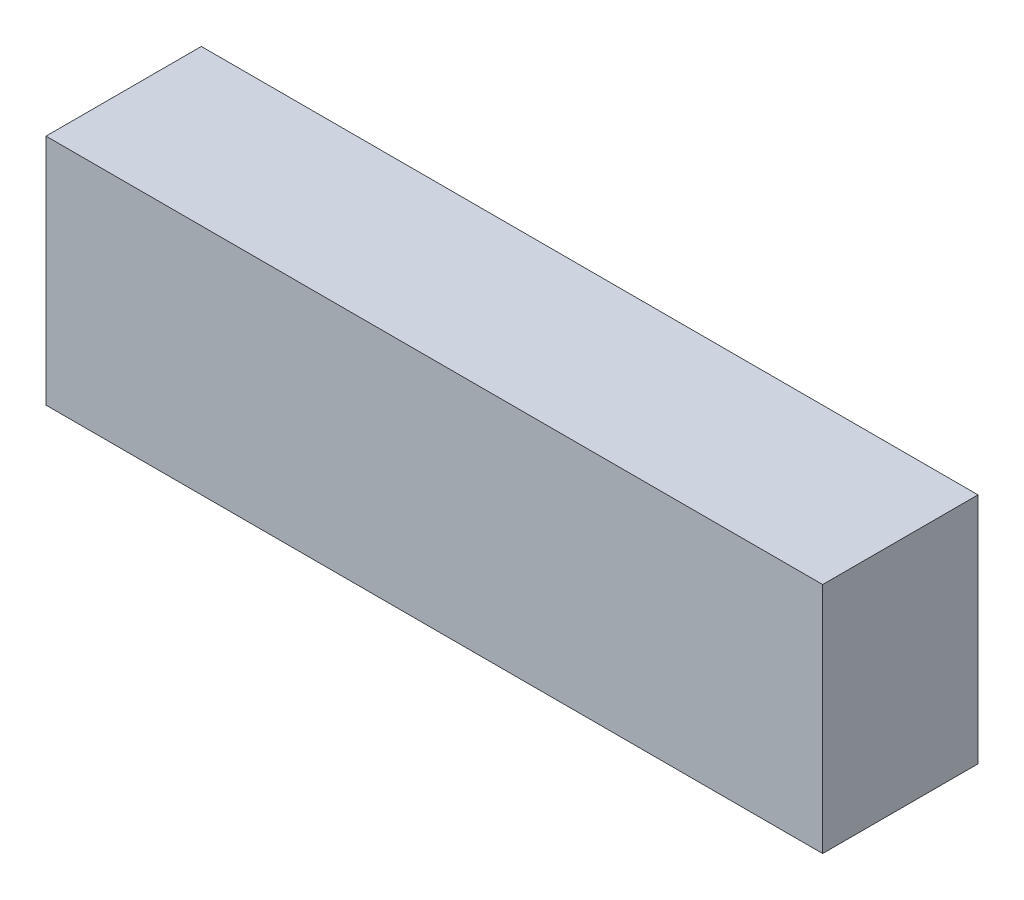
ISO-10303-21;
HEADER;
FILE_DESCRIPTION(('STEP AP214'),'2;1');
FILE_NAME('part.step','',(''),(''),'','','');
FILE_SCHEMA(('AUTOMOTIVE_DESIGN { 1 0 10303 214 1 1 1 1 }'));
ENDSEC;
DATA;
#1=APPLICATION_CONTEXT('core data for automotive mechanical design processes');
#2=APPLICATION_PROTOCOL_DEFINITION('international standard','automotive_design',2000,#1);
#3=PRODUCT_CONTEXT('',#1,'mechanical');
#4=PRODUCT('Part','Part','',(#3));
#5=PRODUCT_RELATED_PRODUCT_CATEGORY('part','',(#4));
#6=PRODUCT_DEFINITION_FORMATION('','',#4);
#7=PRODUCT_DEFINITION_CONTEXT('part definition',#1,'design');
#8=PRODUCT_DEFINITION('design','',#6,#7);
#9=PRODUCT_DEFINITION_SHAPE('','',#8);
#10=(LENGTH_UNIT() NAMED_UNIT(*) SI_UNIT(.MILLI.,.METRE.));
#11=(NAMED_UNIT(*) PLANE_ANGLE_UNIT() SI_UNIT($,.RADIAN.));
#12=(NAMED_UNIT(*) SI_UNIT($,.STERADIAN.) SOLID_ANGLE_UNIT());
#13=UNCERTAINTY_MEASURE_WITH_UNIT(LENGTH_MEASURE(1.E-05),#10,'distance_accuracy_value','');
#14=(GEOMETRIC_REPRESENTATION_CONTEXT(3) GLOBAL_UNCERTAINTY_ASSIGNED_CONTEXT((#13)) GLOBAL_UNIT_ASSIGNED_CONTEXT((#10,
#11,#12)) REPRESENTATION_CONTEXT('',''));
#15=CARTESIAN_POINT('',(0.,0.,0.));
#16=DIRECTION('',(0.,0.,1.));
#17=DIRECTION('',(1.,0.,0.));
#18=AXIS2_PLACEMENT_3D('',#15,#16,#17);
#19=CARTESIAN_POINT('',(30.,-9.,12.));
#20=DIRECTION('',(-1.,0.,0.));
#21=DIRECTION('',(0.,0.,1.));
#22=AXIS2_PLACEMENT_3D('',#19,#20,#21);
#23=PLANE('',#22);
#24=DIRECTION('',(0.,1.,0.));
#25=VECTOR('',#24,1.);
#26=CARTESIAN_POINT('',(30.,-9.,0.));
#27=LINE('',#26,#25);
#28=CARTESIAN_POINT('',(30.,-9.,0.));
#29=VERTEX_POINT('',#28);
#30=CARTESIAN_POINT('',(30.,9.,0.));
#31=VERTEX_POINT('',#30);
#32=EDGE_CURVE('E102',#29,#31,#27,.T.);
#33=ORIENTED_EDGE('',*,*,#32,.T.);
#34=DIRECTION('',(0.,0.,-1.));
#35=VECTOR('',#34,1.);
#36=CARTESIAN_POINT('',(30.,9.,12.));
#37=LINE('',#36,#35);
#38=CARTESIAN_POINT('',(30.,9.,12.));
#39=VERTEX_POINT('',#38);
#40=EDGE_CURVE('E11',#39,#31,#37,.T.);
#41=ORIENTED_EDGE('',*,*,#40,.F.);
#42=DIRECTION('',(0.,1.,0.));
#43=VECTOR('',#42,1.);
#44=CARTESIAN_POINT('',(30.,-9.,12.));
#45=LINE('',#44,#43);
#46=CARTESIAN_POINT('',(30.,-9.,12.));
#47=VERTEX_POINT('',#46);
#48=EDGE_CURVE('E95',#47,#39,#45,.T.);
#49=ORIENTED_EDGE('',*,*,#48,.F.);
#50=DIRECTION('',(0.,0.,-1.));
#51=VECTOR('',#50,1.);
#52=CARTESIAN_POINT('',(30.,-9.,12.));
#53=LINE('',#52,#51);
#54=EDGE_CURVE('E99',#47,#29,#53,.T.);
#55=ORIENTED_EDGE('',*,*,#54,.T.);
#56=EDGE_LOOP('',(#33,#41,#49,#55));
#57=FACE_BOUND('',#56,.T.);
#58=ADVANCED_FACE('F41',(#57),#23,.F.);
#59=CARTESIAN_POINT('',(-30.,9.,12.));
#60=DIRECTION('',(0.,-1.,0.));
#61=DIRECTION('',(0.,0.,-1.));
#62=AXIS2_PLACEMENT_3D('',#59,#60,#61);
#63=PLANE('',#62);
#64=DIRECTION('',(-1.,0.,0.));
#65=VECTOR('',#64,1.);
#66=CARTESIAN_POINT('',(-30.,9.,0.));
#67=LINE('',#66,#65);
#68=CARTESIAN_POINT('',(-30.,9.,0.));
#69=VERTEX_POINT('',#68);
#70=EDGE_CURVE('E96',#31,#69,#67,.T.);
#71=ORIENTED_EDGE('',*,*,#70,.T.);
#72=DIRECTION('',(0.,0.,-1.));
#73=VECTOR('',#72,1.);
#74=CARTESIAN_POINT('',(-30.,9.,12.));
#75=LINE('',#74,#73);
#76=CARTESIAN_POINT('',(-30.,9.,12.));
#77=VERTEX_POINT('',#76);
#78=EDGE_CURVE('E47',#77,#69,#75,.T.);
#79=ORIENTED_EDGE('',*,*,#78,.F.);
#80=DIRECTION('',(-1.,0.,0.));
#81=VECTOR('',#80,1.);
#82=CARTESIAN_POINT('',(-30.,9.,12.));
#83=LINE('',#82,#81);
#84=EDGE_CURVE('E87',#39,#77,#83,.T.);
#85=ORIENTED_EDGE('',*,*,#84,.F.);
#86=ORIENTED_EDGE('',*,*,#40,.T.);
#87=EDGE_LOOP('',(#71,#79,#85,#86));
#88=FACE_BOUND('',#87,.T.);
#89=ADVANCED_FACE('F92',(#88),#63,.F.);
#90=CARTESIAN_POINT('',(-30.,-9.,12.));
#91=DIRECTION('',(1.,0.,0.));
#92=DIRECTION('',(0.,0.,-1.));
#93=AXIS2_PLACEMENT_3D('',#90,#91,#92);
#94=PLANE('',#93);
#95=DIRECTION('',(0.,-1.,0.));
#96=VECTOR('',#95,1.);
#97=CARTESIAN_POINT('',(-30.,-9.,0.));
#98=LINE('',#97,#96);
#99=CARTESIAN_POINT('',(-30.,-9.,0.));
#100=VERTEX_POINT('',#99);
#101=EDGE_CURVE('E74',#69,#100,#98,.T.);
#102=ORIENTED_EDGE('',*,*,#101,.T.);
#103=DIRECTION('',(0.,0.,-1.));
#104=VECTOR('',#103,1.);
#105=CARTESIAN_POINT('',(-30.,-9.,12.));
#106=LINE('',#105,#104);
#107=CARTESIAN_POINT('',(-30.,-9.,12.));
#108=VERTEX_POINT('',#107);
#109=EDGE_CURVE('E100',#108,#100,#106,.T.);
#110=ORIENTED_EDGE('',*,*,#109,.F.);
#111=DIRECTION('',(0.,-1.,0.));
#112=VECTOR('',#111,1.);
#113=CARTESIAN_POINT('',(-30.,-9.,12.));
#114=LINE('',#113,#112);
#115=EDGE_CURVE('E89',#77,#108,#114,.T.);
#116=ORIENTED_EDGE('',*,*,#115,.F.);
#117=ORIENTED_EDGE('',*,*,#78,.T.);
#118=EDGE_LOOP('',(#102,#110,#116,#117));
#119=FACE_BOUND('',#118,.T.);
#120=ADVANCED_FACE('F98',(#119),#94,.F.);
#121=CARTESIAN_POINT('',(-30.,-9.,12.));
#122=DIRECTION('',(0.,1.,0.));
#123=DIRECTION('',(0.,0.,1.));
#124=AXIS2_PLACEMENT_3D('',#121,#122,#123);
#125=PLANE('',#124);
#126=DIRECTION('',(1.,0.,0.));
#127=VECTOR('',#126,1.);
#128=CARTESIAN_POINT('',(-30.,-9.,0.));
#129=LINE('',#128,#127);
#130=EDGE_CURVE('E76',#100,#29,#129,.T.);
#131=ORIENTED_EDGE('',*,*,#130,.T.);
#132=ORIENTED_EDGE('',*,*,#54,.F.);
#133=DIRECTION('',(1.,0.,0.));
#134=VECTOR('',#133,1.);
#135=CARTESIAN_POINT('',(-30.,-9.,12.));
#136=LINE('',#135,#134);
#137=EDGE_CURVE('E60',#108,#47,#136,.T.);
#138=ORIENTED_EDGE('',*,*,#137,.F.);
#139=ORIENTED_EDGE('',*,*,#109,.T.);
#140=EDGE_LOOP('',(#131,#132,#138,#139));
#141=FACE_BOUND('',#140,.T.);
#142=ADVANCED_FACE('F112',(#141),#125,.F.);
#143=CARTESIAN_POINT('',(0.,0.,12.));
#144=DIRECTION('',(0.,0.,-1.));
#145=DIRECTION('',(-1.,0.,0.));
#146=AXIS2_PLACEMENT_3D('',#143,#144,#145);
#147=PLANE('',#146);
#148=ORIENTED_EDGE('',*,*,#48,.T.);
#149=ORIENTED_EDGE('',*,*,#84,.T.);
#150=ORIENTED_EDGE('',*,*,#115,.T.);
#151=ORIENTED_EDGE('',*,*,#137,.T.);
#152=EDGE_LOOP('',(#148,#149,#150,#151));
#153=FACE_BOUND('',#152,.T.);
#154=ADVANCED_FACE('F86',(#153),#147,.F.);
#155=CARTESIAN_POINT('',(0.,0.,0.));
#156=DIRECTION('',(0.,0.,-1.));
#157=DIRECTION('',(-1.,0.,0.));
#158=AXIS2_PLACEMENT_3D('',#155,#156,#157);
#159=PLANE('',#158);
#160=ORIENTED_EDGE('',*,*,#32,.F.);
#161=ORIENTED_EDGE('',*,*,#130,.F.);
#162=ORIENTED_EDGE('',*,*,#101,.F.);
#163=ORIENTED_EDGE('',*,*,#70,.F.);
#164=EDGE_LOOP('',(#160,#161,#162,#163));
#165=FACE_BOUND('',#164,.T.);
#166=ADVANCED_FACE('F111',(#165),#159,.T.);
#167=CLOSED_SHELL('',(#58,#89,#120,#142,#154,#166));
#168=MANIFOLD_SOLID_BREP('B2',#167);
#169=ADVANCED_BREP_SHAPE_REPRESENTATION('',(#18,#168),#14);
#170=SHAPE_DEFINITION_REPRESENTATION(#9,#169);
ENDSEC;
END-ISO-10303-21;
